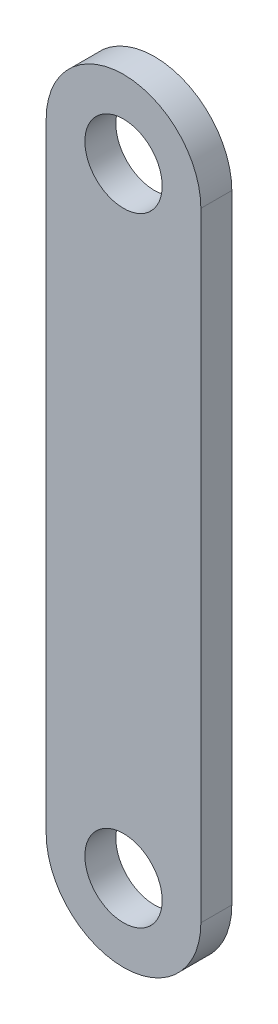
ISO-10303-21;
HEADER;
FILE_DESCRIPTION(('STEP AP214'),'2;1');
FILE_NAME('part.step','',(''),(''),'','','');
FILE_SCHEMA(('AUTOMOTIVE_DESIGN { 1 0 10303 214 1 1 1 1 }'));
ENDSEC;
DATA;
#1=APPLICATION_CONTEXT('core data for automotive mechanical design processes');
#2=APPLICATION_PROTOCOL_DEFINITION('international standard','automotive_design',2000,#1);
#3=PRODUCT_CONTEXT('',#1,'mechanical');
#4=PRODUCT('Part','Part','',(#3));
#5=PRODUCT_RELATED_PRODUCT_CATEGORY('part','',(#4));
#6=PRODUCT_DEFINITION_FORMATION('','',#4);
#7=PRODUCT_DEFINITION_CONTEXT('part definition',#1,'design');
#8=PRODUCT_DEFINITION('design','',#6,#7);
#9=PRODUCT_DEFINITION_SHAPE('','',#8);
#10=(LENGTH_UNIT() NAMED_UNIT(*) SI_UNIT(.MILLI.,.METRE.));
#11=(NAMED_UNIT(*) PLANE_ANGLE_UNIT() SI_UNIT($,.RADIAN.));
#12=(NAMED_UNIT(*) SI_UNIT($,.STERADIAN.) SOLID_ANGLE_UNIT());
#13=UNCERTAINTY_MEASURE_WITH_UNIT(LENGTH_MEASURE(1.E-05),#10,'distance_accuracy_value','');
#14=(GEOMETRIC_REPRESENTATION_CONTEXT(3) GLOBAL_UNCERTAINTY_ASSIGNED_CONTEXT((#13)) GLOBAL_UNIT_ASSIGNED_CONTEXT((#10,
#11,#12)) REPRESENTATION_CONTEXT('',''));
#15=CARTESIAN_POINT('',(0.,0.,0.));
#16=DIRECTION('',(0.,0.,1.));
#17=DIRECTION('',(1.,0.,0.));
#18=AXIS2_PLACEMENT_3D('',#15,#16,#17);
#19=CARTESIAN_POINT('',(0.,7.5,2.));
#20=DIRECTION('',(0.,0.,1.));
#21=DIRECTION('',(1.,0.,0.));
#22=AXIS2_PLACEMENT_3D('',#19,#20,#21);
#23=PLANE('',#22);
#24=CARTESIAN_POINT('',(0.,7.5,2.));
#25=DIRECTION('',(0.,0.,1.));
#26=DIRECTION('',(1.,0.,0.));
#27=AXIS2_PLACEMENT_3D('',#24,#25,#26);
#28=CIRCLE('',#27,2.5);
#29=CARTESIAN_POINT('',(2.5,7.5,2.));
#30=VERTEX_POINT('',#29);
#31=EDGE_CURVE('E102',#30,#30,#28,.T.);
#32=ORIENTED_EDGE('',*,*,#31,.F.);
#33=EDGE_LOOP('',(#32));
#34=FACE_BOUND('',#33,.T.);
#35=CARTESIAN_POINT('',(0.,7.5,2.));
#36=DIRECTION('',(0.,0.,1.));
#37=DIRECTION('',(1.,0.,0.));
#38=AXIS2_PLACEMENT_3D('',#35,#36,#37);
#39=CIRCLE('',#38,5.);
#40=CARTESIAN_POINT('',(-5.,7.5,2.));
#41=VERTEX_POINT('',#40);
#42=CARTESIAN_POINT('',(5.,7.5,2.));
#43=VERTEX_POINT('',#42);
#44=EDGE_CURVE('E87',#41,#43,#39,.T.);
#45=ORIENTED_EDGE('',*,*,#44,.T.);
#46=DIRECTION('',(0.,1.,0.));
#47=VECTOR('',#46,1.);
#48=CARTESIAN_POINT('',(5.,7.5,2.));
#49=LINE('',#48,#47);
#50=CARTESIAN_POINT('',(5.,47.5,2.));
#51=VERTEX_POINT('',#50);
#52=EDGE_CURVE('E82',#43,#51,#49,.T.);
#53=ORIENTED_EDGE('',*,*,#52,.T.);
#54=CARTESIAN_POINT('',(0.,47.5,2.));
#55=DIRECTION('',(0.,0.,1.));
#56=DIRECTION('',(1.,0.,0.));
#57=AXIS2_PLACEMENT_3D('',#54,#55,#56);
#58=CIRCLE('',#57,5.);
#59=CARTESIAN_POINT('',(-5.,47.5,2.));
#60=VERTEX_POINT('',#59);
#61=EDGE_CURVE('E85',#51,#60,#58,.T.);
#62=ORIENTED_EDGE('',*,*,#61,.T.);
#63=DIRECTION('',(0.,-1.,0.));
#64=VECTOR('',#63,1.);
#65=CARTESIAN_POINT('',(-5.,7.5,2.));
#66=LINE('',#65,#64);
#67=EDGE_CURVE('E52',#60,#41,#66,.T.);
#68=ORIENTED_EDGE('',*,*,#67,.T.);
#69=EDGE_LOOP('',(#45,#53,#62,#68));
#70=FACE_BOUND('',#69,.T.);
#71=CARTESIAN_POINT('',(0.,47.5,2.));
#72=DIRECTION('',(0.,0.,1.));
#73=DIRECTION('',(1.,0.,0.));
#74=AXIS2_PLACEMENT_3D('',#71,#72,#73);
#75=CIRCLE('',#74,2.5);
#76=CARTESIAN_POINT('',(2.5,47.5,2.));
#77=VERTEX_POINT('',#76);
#78=EDGE_CURVE('E117',#77,#77,#75,.T.);
#79=ORIENTED_EDGE('',*,*,#78,.F.);
#80=EDGE_LOOP('',(#79));
#81=FACE_BOUND('',#80,.T.);
#82=ADVANCED_FACE('F35',(#34,#70,#81),#23,.T.);
#83=CARTESIAN_POINT('',(0.,7.5,0.));
#84=DIRECTION('',(0.,0.,1.));
#85=DIRECTION('',(1.,0.,0.));
#86=AXIS2_PLACEMENT_3D('',#83,#84,#85);
#87=PLANE('',#86);
#88=CARTESIAN_POINT('',(0.,7.5,0.));
#89=DIRECTION('',(0.,0.,1.));
#90=DIRECTION('',(1.,0.,0.));
#91=AXIS2_PLACEMENT_3D('',#88,#89,#90);
#92=CIRCLE('',#91,5.);
#93=CARTESIAN_POINT('',(-5.,7.5,0.));
#94=VERTEX_POINT('',#93);
#95=CARTESIAN_POINT('',(5.,7.5,0.));
#96=VERTEX_POINT('',#95);
#97=EDGE_CURVE('E99',#94,#96,#92,.T.);
#98=ORIENTED_EDGE('',*,*,#97,.F.);
#99=DIRECTION('',(0.,-1.,0.));
#100=VECTOR('',#99,1.);
#101=CARTESIAN_POINT('',(-5.,7.5,0.));
#102=LINE('',#101,#100);
#103=CARTESIAN_POINT('',(-5.,47.5,0.));
#104=VERTEX_POINT('',#103);
#105=EDGE_CURVE('E75',#104,#94,#102,.T.);
#106=ORIENTED_EDGE('',*,*,#105,.F.);
#107=CARTESIAN_POINT('',(0.,47.5,0.));
#108=DIRECTION('',(0.,0.,1.));
#109=DIRECTION('',(1.,0.,0.));
#110=AXIS2_PLACEMENT_3D('',#107,#108,#109);
#111=CIRCLE('',#110,5.);
#112=CARTESIAN_POINT('',(5.,47.5,0.));
#113=VERTEX_POINT('',#112);
#114=EDGE_CURVE('E69',#113,#104,#111,.T.);
#115=ORIENTED_EDGE('',*,*,#114,.F.);
#116=DIRECTION('',(0.,1.,0.));
#117=VECTOR('',#116,1.);
#118=CARTESIAN_POINT('',(5.,7.5,0.));
#119=LINE('',#118,#117);
#120=EDGE_CURVE('E91',#96,#113,#119,.T.);
#121=ORIENTED_EDGE('',*,*,#120,.F.);
#122=EDGE_LOOP('',(#98,#106,#115,#121));
#123=FACE_BOUND('',#122,.T.);
#124=CARTESIAN_POINT('',(0.,7.5,0.));
#125=DIRECTION('',(0.,0.,1.));
#126=DIRECTION('',(1.,0.,0.));
#127=AXIS2_PLACEMENT_3D('',#124,#125,#126);
#128=CIRCLE('',#127,2.5);
#129=CARTESIAN_POINT('',(2.5,7.5,0.));
#130=VERTEX_POINT('',#129);
#131=EDGE_CURVE('E114',#130,#130,#128,.T.);
#132=ORIENTED_EDGE('',*,*,#131,.T.);
#133=EDGE_LOOP('',(#132));
#134=FACE_BOUND('',#133,.T.);
#135=CARTESIAN_POINT('',(0.,47.5,0.));
#136=DIRECTION('',(0.,0.,1.));
#137=DIRECTION('',(1.,0.,0.));
#138=AXIS2_PLACEMENT_3D('',#135,#136,#137);
#139=CIRCLE('',#138,2.5);
#140=CARTESIAN_POINT('',(2.5,47.5,0.));
#141=VERTEX_POINT('',#140);
#142=EDGE_CURVE('E120',#141,#141,#139,.T.);
#143=ORIENTED_EDGE('',*,*,#142,.T.);
#144=EDGE_LOOP('',(#143));
#145=FACE_BOUND('',#144,.T.);
#146=ADVANCED_FACE('F110',(#123,#134,#145),#87,.F.);
#147=CARTESIAN_POINT('',(0.,7.5,2.));
#148=DIRECTION('',(0.,0.,-1.));
#149=DIRECTION('',(-1.,0.,0.));
#150=AXIS2_PLACEMENT_3D('',#147,#148,#149);
#151=CYLINDRICAL_SURFACE('',#150,5.);
#152=ORIENTED_EDGE('',*,*,#97,.T.);
#153=DIRECTION('',(0.,0.,-1.));
#154=VECTOR('',#153,1.);
#155=CARTESIAN_POINT('',(5.,7.5,2.));
#156=LINE('',#155,#154);
#157=EDGE_CURVE('E11',#43,#96,#156,.T.);
#158=ORIENTED_EDGE('',*,*,#157,.F.);
#159=ORIENTED_EDGE('',*,*,#44,.F.);
#160=DIRECTION('',(0.,0.,-1.));
#161=VECTOR('',#160,1.);
#162=CARTESIAN_POINT('',(-5.,7.5,2.));
#163=LINE('',#162,#161);
#164=EDGE_CURVE('E95',#41,#94,#163,.T.);
#165=ORIENTED_EDGE('',*,*,#164,.T.);
#166=EDGE_LOOP('',(#152,#158,#159,#165));
#167=FACE_BOUND('',#166,.T.);
#168=ADVANCED_FACE('F37',(#167),#151,.T.);
#169=CARTESIAN_POINT('',(5.,7.5,2.));
#170=DIRECTION('',(-1.,0.,0.));
#171=DIRECTION('',(0.,0.,1.));
#172=AXIS2_PLACEMENT_3D('',#169,#170,#171);
#173=PLANE('',#172);
#174=ORIENTED_EDGE('',*,*,#120,.T.);
#175=DIRECTION('',(0.,0.,-1.));
#176=VECTOR('',#175,1.);
#177=CARTESIAN_POINT('',(5.,47.5,2.));
#178=LINE('',#177,#176);
#179=EDGE_CURVE('E44',#51,#113,#178,.T.);
#180=ORIENTED_EDGE('',*,*,#179,.F.);
#181=ORIENTED_EDGE('',*,*,#52,.F.);
#182=ORIENTED_EDGE('',*,*,#157,.T.);
#183=EDGE_LOOP('',(#174,#180,#181,#182));
#184=FACE_BOUND('',#183,.T.);
#185=ADVANCED_FACE('F90',(#184),#173,.F.);
#186=CARTESIAN_POINT('',(0.,47.5,2.));
#187=DIRECTION('',(0.,0.,-1.));
#188=DIRECTION('',(-1.,0.,0.));
#189=AXIS2_PLACEMENT_3D('',#186,#187,#188);
#190=CYLINDRICAL_SURFACE('',#189,5.);
#191=ORIENTED_EDGE('',*,*,#114,.T.);
#192=DIRECTION('',(0.,0.,-1.));
#193=VECTOR('',#192,1.);
#194=CARTESIAN_POINT('',(-5.,47.5,2.));
#195=LINE('',#194,#193);
#196=EDGE_CURVE('E92',#60,#104,#195,.T.);
#197=ORIENTED_EDGE('',*,*,#196,.F.);
#198=ORIENTED_EDGE('',*,*,#61,.F.);
#199=ORIENTED_EDGE('',*,*,#179,.T.);
#200=EDGE_LOOP('',(#191,#197,#198,#199));
#201=FACE_BOUND('',#200,.T.);
#202=ADVANCED_FACE('F93',(#201),#190,.T.);
#203=CARTESIAN_POINT('',(-5.,7.5,2.));
#204=DIRECTION('',(1.,0.,0.));
#205=DIRECTION('',(0.,0.,-1.));
#206=AXIS2_PLACEMENT_3D('',#203,#204,#205);
#207=PLANE('',#206);
#208=ORIENTED_EDGE('',*,*,#105,.T.);
#209=ORIENTED_EDGE('',*,*,#164,.F.);
#210=ORIENTED_EDGE('',*,*,#67,.F.);
#211=ORIENTED_EDGE('',*,*,#196,.T.);
#212=EDGE_LOOP('',(#208,#209,#210,#211));
#213=FACE_BOUND('',#212,.T.);
#214=ADVANCED_FACE('F107',(#213),#207,.F.);
#215=CARTESIAN_POINT('',(0.,7.5,2.));
#216=DIRECTION('',(0.,0.,-1.));
#217=DIRECTION('',(-1.,0.,0.));
#218=AXIS2_PLACEMENT_3D('',#215,#216,#217);
#219=CYLINDRICAL_SURFACE('',#218,2.5);
#220=ORIENTED_EDGE('',*,*,#31,.T.);
#221=EDGE_LOOP('',(#220));
#222=FACE_BOUND('',#221,.T.);
#223=ORIENTED_EDGE('',*,*,#131,.F.);
#224=EDGE_LOOP('',(#223));
#225=FACE_BOUND('',#224,.T.);
#226=ADVANCED_FACE('F137',(#222,#225),#219,.F.);
#227=CARTESIAN_POINT('',(0.,47.5,2.));
#228=DIRECTION('',(0.,0.,-1.));
#229=DIRECTION('',(-1.,0.,0.));
#230=AXIS2_PLACEMENT_3D('',#227,#228,#229);
#231=CYLINDRICAL_SURFACE('',#230,2.5);
#232=ORIENTED_EDGE('',*,*,#78,.T.);
#233=EDGE_LOOP('',(#232));
#234=FACE_BOUND('',#233,.T.);
#235=ORIENTED_EDGE('',*,*,#142,.F.);
#236=EDGE_LOOP('',(#235));
#237=FACE_BOUND('',#236,.T.);
#238=ADVANCED_FACE('F126',(#234,#237),#231,.F.);
#239=CLOSED_SHELL('',(#82,#146,#168,#185,#202,#214,#226,#238));
#240=MANIFOLD_SOLID_BREP('B2',#239);
#241=ADVANCED_BREP_SHAPE_REPRESENTATION('',(#18,#240),#14);
#242=SHAPE_DEFINITION_REPRESENTATION(#9,#241);
ENDSEC;
END-ISO-10303-21;
